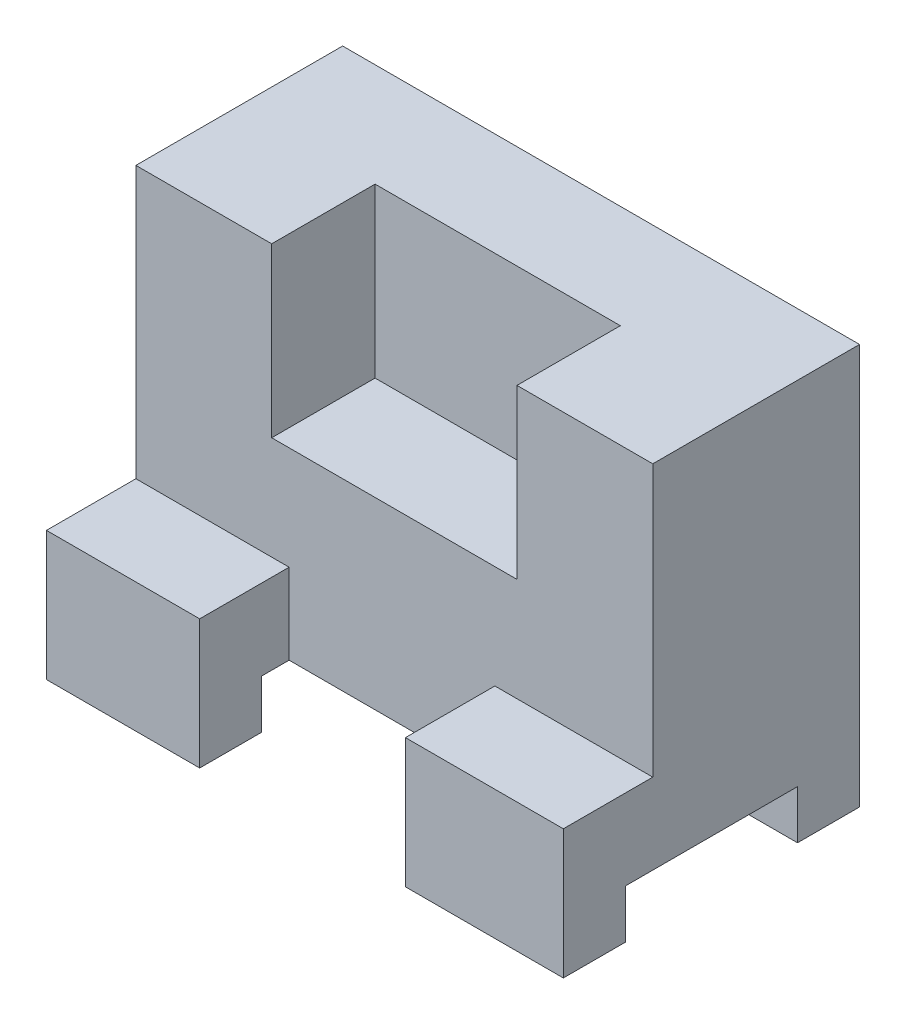
ISO-10303-21;
HEADER;
FILE_DESCRIPTION(('STEP AP214'),'2;1');
FILE_NAME('part.step','',(''),(''),'','','');
FILE_SCHEMA(('AUTOMOTIVE_DESIGN { 1 0 10303 214 1 1 1 1 }'));
ENDSEC;
DATA;
#1=APPLICATION_CONTEXT('core data for automotive mechanical design processes');
#2=APPLICATION_PROTOCOL_DEFINITION('international standard','automotive_design',2000,#1);
#3=PRODUCT_CONTEXT('',#1,'mechanical');
#4=PRODUCT('Part','Part','',(#3));
#5=PRODUCT_RELATED_PRODUCT_CATEGORY('part','',(#4));
#6=PRODUCT_DEFINITION_FORMATION('','',#4);
#7=PRODUCT_DEFINITION_CONTEXT('part definition',#1,'design');
#8=PRODUCT_DEFINITION('design','',#6,#7);
#9=PRODUCT_DEFINITION_SHAPE('','',#8);
#10=(LENGTH_UNIT() NAMED_UNIT(*) SI_UNIT(.MILLI.,.METRE.));
#11=(NAMED_UNIT(*) PLANE_ANGLE_UNIT() SI_UNIT($,.RADIAN.));
#12=(NAMED_UNIT(*) SI_UNIT($,.STERADIAN.) SOLID_ANGLE_UNIT());
#13=UNCERTAINTY_MEASURE_WITH_UNIT(LENGTH_MEASURE(1.E-05),#10,'distance_accuracy_value','');
#14=(GEOMETRIC_REPRESENTATION_CONTEXT(3) GLOBAL_UNCERTAINTY_ASSIGNED_CONTEXT((#13)) GLOBAL_UNIT_ASSIGNED_CONTEXT((#10,
#11,#12)) REPRESENTATION_CONTEXT('',''));
#15=CARTESIAN_POINT('',(0.,0.,0.));
#16=DIRECTION('',(0.,0.,1.));
#17=DIRECTION('',(1.,0.,0.));
#18=AXIS2_PLACEMENT_3D('',#15,#16,#17);
#19=CARTESIAN_POINT('',(0.,-114.3,0.));
#20=DIRECTION('',(0.,-1.,0.));
#21=DIRECTION('',(0.,0.,-1.));
#22=AXIS2_PLACEMENT_3D('',#19,#20,#21);
#23=PLANE('',#22);
#24=DIRECTION('',(-1.,0.,0.));
#25=VECTOR('',#24,1.);
#26=CARTESIAN_POINT('',(0.,-114.3,115.064252785648));
#27=LINE('',#26,#25);
#28=CARTESIAN_POINT('',(127.,-114.3,115.064252785648));
#29=VERTEX_POINT('',#28);
#30=CARTESIAN_POINT('',(49.406360537615,-114.3,115.064252785648));
#31=VERTEX_POINT('',#30);
#32=EDGE_CURVE('E49',#29,#31,#27,.T.);
#33=ORIENTED_EDGE('',*,*,#32,.F.);
#34=DIRECTION('',(0.,0.,1.));
#35=VECTOR('',#34,1.);
#36=CARTESIAN_POINT('',(127.,-114.3,0.));
#37=LINE('',#36,#35);
#38=CARTESIAN_POINT('',(127.,-114.3,145.544252785648));
#39=VERTEX_POINT('',#38);
#40=EDGE_CURVE('E232',#29,#39,#37,.T.);
#41=ORIENTED_EDGE('',*,*,#40,.T.);
#42=DIRECTION('',(-0.999999999960668,0.,-8.86923483296824E-06));
#43=VECTOR('',#42,1.);
#44=CARTESIAN_POINT('',(127.,-114.3,145.544252785648));
#45=LINE('',#44,#43);
#46=CARTESIAN_POINT('',(49.406360537615,-114.3,145.543564589438));
#47=VERTEX_POINT('',#46);
#48=EDGE_CURVE('E231',#39,#47,#45,.T.);
#49=ORIENTED_EDGE('',*,*,#48,.T.);
#50=DIRECTION('',(0.,0.,-1.));
#51=VECTOR('',#50,1.);
#52=CARTESIAN_POINT('',(49.406360537615,-114.3,145.543564589438));
#53=LINE('',#52,#51);
#54=EDGE_CURVE('E234',#47,#31,#53,.T.);
#55=ORIENTED_EDGE('',*,*,#54,.T.);
#56=EDGE_LOOP('',(#33,#41,#49,#55));
#57=FACE_BOUND('',#56,.T.);
#58=ADVANCED_FACE('F41',(#57),#23,.T.);
#59=DIRECTION('',(1.,0.,0.));
#60=VECTOR('',#59,1.);
#61=CARTESIAN_POINT('',(-127.,-114.3,115.064252785648));
#62=LINE('',#61,#60);
#63=CARTESIAN_POINT('',(-127.,-114.3,115.064252785648));
#64=VERTEX_POINT('',#63);
#65=CARTESIAN_POINT('',(-51.7027874079581,-114.3,115.064252785648));
#66=VERTEX_POINT('',#65);
#67=EDGE_CURVE('E205',#64,#66,#62,.T.);
#68=ORIENTED_EDGE('',*,*,#67,.T.);
#69=DIRECTION('',(0.,0.,1.));
#70=VECTOR('',#69,1.);
#71=CARTESIAN_POINT('',(-51.7027874079581,-114.3,101.6));
#72=LINE('',#71,#70);
#73=CARTESIAN_POINT('',(-51.7027874079581,-114.3,145.542667828661));
#74=VERTEX_POINT('',#73);
#75=EDGE_CURVE('E237',#66,#74,#72,.T.);
#76=ORIENTED_EDGE('',*,*,#75,.T.);
#77=DIRECTION('',(-0.999999999960668,0.,-8.86923483280691E-06));
#78=VECTOR('',#77,1.);
#79=CARTESIAN_POINT('',(-51.7027874079581,-114.3,145.542667828661));
#80=LINE('',#79,#78);
#81=CARTESIAN_POINT('',(-127.,-114.3,145.542));
#82=VERTEX_POINT('',#81);
#83=EDGE_CURVE('E239',#74,#82,#80,.T.);
#84=ORIENTED_EDGE('',*,*,#83,.T.);
#85=DIRECTION('',(0.,0.,-1.));
#86=VECTOR('',#85,1.);
#87=CARTESIAN_POINT('',(-127.,-114.3,145.542));
#88=LINE('',#87,#86);
#89=EDGE_CURVE('E241',#82,#64,#88,.T.);
#90=ORIENTED_EDGE('',*,*,#89,.T.);
#91=EDGE_LOOP('',(#68,#76,#84,#90));
#92=FACE_BOUND('',#91,.T.);
#93=ADVANCED_FACE('F389',(#92),#23,.T.);
#94=CARTESIAN_POINT('',(0.,0.,101.6));
#95=DIRECTION('',(0.,0.,-1.));
#96=DIRECTION('',(-1.,0.,0.));
#97=AXIS2_PLACEMENT_3D('',#94,#95,#96);
#98=PLANE('',#97);
#99=DIRECTION('',(0.,1.,0.));
#100=VECTOR('',#99,1.);
#101=CARTESIAN_POINT('',(-51.7027874079581,0.,101.6));
#102=LINE('',#101,#100);
#103=CARTESIAN_POINT('',(-51.7027874079581,-90.3754778035292,101.6));
#104=VERTEX_POINT('',#103);
#105=CARTESIAN_POINT('',(-51.7027874079581,-50.8,101.6));
#106=VERTEX_POINT('',#105);
#107=EDGE_CURVE('E326',#104,#106,#102,.T.);
#108=ORIENTED_EDGE('',*,*,#107,.F.);
#109=DIRECTION('',(1.,0.,0.));
#110=VECTOR('',#109,1.);
#111=CARTESIAN_POINT('',(0.,-90.3754778035292,101.6));
#112=LINE('',#111,#110);
#113=CARTESIAN_POINT('',(49.406360537615,-90.3754778035292,101.6));
#114=VERTEX_POINT('',#113);
#115=EDGE_CURVE('E220',#104,#114,#112,.T.);
#116=ORIENTED_EDGE('',*,*,#115,.T.);
#117=DIRECTION('',(0.,-1.,0.));
#118=VECTOR('',#117,1.);
#119=CARTESIAN_POINT('',(49.406360537615,0.,101.6));
#120=LINE('',#119,#118);
#121=CARTESIAN_POINT('',(49.406360537615,-50.8,101.6));
#122=VERTEX_POINT('',#121);
#123=EDGE_CURVE('E64',#122,#114,#120,.T.);
#124=ORIENTED_EDGE('',*,*,#123,.F.);
#125=DIRECTION('',(-1.,0.,0.));
#126=VECTOR('',#125,1.);
#127=CARTESIAN_POINT('',(0.,-50.8,101.6));
#128=LINE('',#127,#126);
#129=CARTESIAN_POINT('',(127.,-50.8,101.6));
#130=VERTEX_POINT('',#129);
#131=EDGE_CURVE('E276',#130,#122,#128,.T.);
#132=ORIENTED_EDGE('',*,*,#131,.F.);
#133=DIRECTION('',(0.,1.,0.));
#134=VECTOR('',#133,1.);
#135=CARTESIAN_POINT('',(127.,-82.55,101.6));
#136=LINE('',#135,#134);
#137=CARTESIAN_POINT('',(127.,82.55,101.6));
#138=VERTEX_POINT('',#137);
#139=EDGE_CURVE('E307',#130,#138,#136,.T.);
#140=ORIENTED_EDGE('',*,*,#139,.T.);
#141=DIRECTION('',(-1.,0.,0.));
#142=VECTOR('',#141,1.);
#143=CARTESIAN_POINT('',(-127.,82.55,101.6));
#144=LINE('',#143,#142);
#145=CARTESIAN_POINT('',(60.2599117359153,82.55,101.6));
#146=VERTEX_POINT('',#145);
#147=EDGE_CURVE('E311',#138,#146,#144,.T.);
#148=ORIENTED_EDGE('',*,*,#147,.T.);
#149=DIRECTION('',(0.,1.,0.));
#150=VECTOR('',#149,1.);
#151=CARTESIAN_POINT('',(60.2599117359153,82.55,101.6));
#152=LINE('',#151,#150);
#153=CARTESIAN_POINT('',(60.2599117359153,0.,101.6));
#154=VERTEX_POINT('',#153);
#155=EDGE_CURVE('E281',#154,#146,#152,.T.);
#156=ORIENTED_EDGE('',*,*,#155,.F.);
#157=DIRECTION('',(1.,0.,0.));
#158=VECTOR('',#157,1.);
#159=CARTESIAN_POINT('',(60.2599117359153,0.,101.6));
#160=LINE('',#159,#158);
#161=CARTESIAN_POINT('',(-60.2599117359153,0.,101.6));
#162=VERTEX_POINT('',#161);
#163=EDGE_CURVE('E293',#162,#154,#160,.T.);
#164=ORIENTED_EDGE('',*,*,#163,.F.);
#165=DIRECTION('',(0.,-1.,0.));
#166=VECTOR('',#165,1.);
#167=CARTESIAN_POINT('',(-60.2599117359153,82.55,101.6));
#168=LINE('',#167,#166);
#169=CARTESIAN_POINT('',(-60.2599117359153,82.55,101.6));
#170=VERTEX_POINT('',#169);
#171=EDGE_CURVE('E291',#170,#162,#168,.T.);
#172=ORIENTED_EDGE('',*,*,#171,.F.);
#173=CARTESIAN_POINT('',(-127.,82.55,101.6));
#174=VERTEX_POINT('',#173);
#175=EDGE_CURVE('E309',#170,#174,#144,.T.);
#176=ORIENTED_EDGE('',*,*,#175,.T.);
#177=DIRECTION('',(0.,-1.,0.));
#178=VECTOR('',#177,1.);
#179=CARTESIAN_POINT('',(-127.,-82.55,101.6));
#180=LINE('',#179,#178);
#181=CARTESIAN_POINT('',(-127.,-50.8,101.6));
#182=VERTEX_POINT('',#181);
#183=EDGE_CURVE('E314',#174,#182,#180,.T.);
#184=ORIENTED_EDGE('',*,*,#183,.T.);
#185=EDGE_CURVE('E273',#106,#182,#128,.T.);
#186=ORIENTED_EDGE('',*,*,#185,.F.);
#187=EDGE_LOOP('',(#108,#116,#124,#132,#140,#148,#156,#164,#172,#176,#184,#186));
#188=FACE_BOUND('',#187,.T.);
#189=ADVANCED_FACE('F349',(#188),#98,.F.);
#190=CARTESIAN_POINT('',(127.,-82.55,101.6));
#191=DIRECTION('',(-1.,0.,0.));
#192=DIRECTION('',(0.,0.,1.));
#193=AXIS2_PLACEMENT_3D('',#190,#191,#192);
#194=PLANE('',#193);
#195=ORIENTED_EDGE('',*,*,#40,.F.);
#196=DIRECTION('',(0.,1.,0.));
#197=VECTOR('',#196,1.);
#198=CARTESIAN_POINT('',(127.,-82.55,115.064252785648));
#199=LINE('',#198,#197);
#200=CARTESIAN_POINT('',(127.,-90.3754778035292,115.064252785648));
#201=VERTEX_POINT('',#200);
#202=EDGE_CURVE('E217',#29,#201,#199,.T.);
#203=ORIENTED_EDGE('',*,*,#202,.T.);
#204=DIRECTION('',(0.,0.,-1.));
#205=VECTOR('',#204,1.);
#206=CARTESIAN_POINT('',(127.,-90.3754778035292,101.6));
#207=LINE('',#206,#205);
#208=CARTESIAN_POINT('',(127.,-90.3754778035292,30.48));
#209=VERTEX_POINT('',#208);
#210=EDGE_CURVE('E225',#201,#209,#207,.T.);
#211=ORIENTED_EDGE('',*,*,#210,.T.);
#212=DIRECTION('',(0.,-1.,0.));
#213=VECTOR('',#212,1.);
#214=CARTESIAN_POINT('',(127.,-82.55,30.48));
#215=LINE('',#214,#213);
#216=CARTESIAN_POINT('',(127.,-114.3,30.48));
#217=VERTEX_POINT('',#216);
#218=EDGE_CURVE('E181',#209,#217,#215,.T.);
#219=ORIENTED_EDGE('',*,*,#218,.T.);
#220=CARTESIAN_POINT('',(127.,-114.3,0.));
#221=VERTEX_POINT('',#220);
#222=EDGE_CURVE('E228',#221,#217,#37,.T.);
#223=ORIENTED_EDGE('',*,*,#222,.F.);
#224=DIRECTION('',(0.,1.,0.));
#225=VECTOR('',#224,1.);
#226=CARTESIAN_POINT('',(127.,-82.55,0.));
#227=LINE('',#226,#225);
#228=CARTESIAN_POINT('',(127.,82.55,0.));
#229=VERTEX_POINT('',#228);
#230=EDGE_CURVE('E299',#221,#229,#227,.T.);
#231=ORIENTED_EDGE('',*,*,#230,.T.);
#232=DIRECTION('',(0.,0.,-1.));
#233=VECTOR('',#232,1.);
#234=CARTESIAN_POINT('',(127.,82.55,101.6));
#235=LINE('',#234,#233);
#236=EDGE_CURVE('E323',#138,#229,#235,.T.);
#237=ORIENTED_EDGE('',*,*,#236,.F.);
#238=ORIENTED_EDGE('',*,*,#139,.F.);
#239=DIRECTION('',(0.,0.,1.));
#240=VECTOR('',#239,1.);
#241=CARTESIAN_POINT('',(127.,-50.8,101.6));
#242=LINE('',#241,#240);
#243=CARTESIAN_POINT('',(127.,-50.8,145.544252785648));
#244=VERTEX_POINT('',#243);
#245=EDGE_CURVE('E227',#130,#244,#242,.T.);
#246=ORIENTED_EDGE('',*,*,#245,.T.);
#247=DIRECTION('',(0.,1.,0.));
#248=VECTOR('',#247,1.);
#249=CARTESIAN_POINT('',(127.,-114.3,145.544252785648));
#250=LINE('',#249,#248);
#251=EDGE_CURVE('E270',#39,#244,#250,.T.);
#252=ORIENTED_EDGE('',*,*,#251,.F.);
#253=EDGE_LOOP('',(#195,#203,#211,#219,#223,#231,#237,#238,#246,#252));
#254=FACE_BOUND('',#253,.T.);
#255=ADVANCED_FACE('F43',(#254),#194,.F.);
#256=CARTESIAN_POINT('',(-127.,82.55,101.6));
#257=DIRECTION('',(0.,-1.,0.));
#258=DIRECTION('',(0.,0.,-1.));
#259=AXIS2_PLACEMENT_3D('',#256,#257,#258);
#260=PLANE('',#259);
#261=ORIENTED_EDGE('',*,*,#175,.F.);
#262=DIRECTION('',(0.,0.,1.));
#263=VECTOR('',#262,1.);
#264=CARTESIAN_POINT('',(-60.2599117359153,82.55,50.8));
#265=LINE('',#264,#263);
#266=CARTESIAN_POINT('',(-60.2599117359153,82.55,50.8));
#267=VERTEX_POINT('',#266);
#268=EDGE_CURVE('E297',#267,#170,#265,.T.);
#269=ORIENTED_EDGE('',*,*,#268,.F.);
#270=DIRECTION('',(-1.,0.,0.));
#271=VECTOR('',#270,1.);
#272=CARTESIAN_POINT('',(-60.2599117359153,82.55,50.8));
#273=LINE('',#272,#271);
#274=CARTESIAN_POINT('',(60.2599117359153,82.55,50.8));
#275=VERTEX_POINT('',#274);
#276=EDGE_CURVE('E287',#275,#267,#273,.T.);
#277=ORIENTED_EDGE('',*,*,#276,.F.);
#278=DIRECTION('',(0.,0.,1.));
#279=VECTOR('',#278,1.);
#280=CARTESIAN_POINT('',(60.2599117359153,82.55,50.8));
#281=LINE('',#280,#279);
#282=EDGE_CURVE('E300',#275,#146,#281,.T.);
#283=ORIENTED_EDGE('',*,*,#282,.T.);
#284=ORIENTED_EDGE('',*,*,#147,.F.);
#285=ORIENTED_EDGE('',*,*,#236,.T.);
#286=DIRECTION('',(-1.,0.,0.));
#287=VECTOR('',#286,1.);
#288=CARTESIAN_POINT('',(-127.,82.55,0.));
#289=LINE('',#288,#287);
#290=CARTESIAN_POINT('',(-127.,82.55,0.));
#291=VERTEX_POINT('',#290);
#292=EDGE_CURVE('E318',#229,#291,#289,.T.);
#293=ORIENTED_EDGE('',*,*,#292,.T.);
#294=DIRECTION('',(0.,0.,-1.));
#295=VECTOR('',#294,1.);
#296=CARTESIAN_POINT('',(-127.,82.55,101.6));
#297=LINE('',#296,#295);
#298=EDGE_CURVE('E316',#174,#291,#297,.T.);
#299=ORIENTED_EDGE('',*,*,#298,.F.);
#300=EDGE_LOOP('',(#261,#269,#277,#283,#284,#285,#293,#299));
#301=FACE_BOUND('',#300,.T.);
#302=ADVANCED_FACE('F357',(#301),#260,.F.);
#303=CARTESIAN_POINT('',(-127.,-82.55,101.6));
#304=DIRECTION('',(1.,0.,0.));
#305=DIRECTION('',(0.,0.,-1.));
#306=AXIS2_PLACEMENT_3D('',#303,#304,#305);
#307=PLANE('',#306);
#308=DIRECTION('',(0.,0.,1.));
#309=VECTOR('',#308,1.);
#310=CARTESIAN_POINT('',(-127.,-90.3754778035292,115.064252785648));
#311=LINE('',#310,#309);
#312=CARTESIAN_POINT('',(-127.,-90.3754778035292,30.48));
#313=VERTEX_POINT('',#312);
#314=CARTESIAN_POINT('',(-127.,-90.3754778035292,115.064252785648));
#315=VERTEX_POINT('',#314);
#316=EDGE_CURVE('E188',#313,#315,#311,.T.);
#317=ORIENTED_EDGE('',*,*,#316,.T.);
#318=DIRECTION('',(0.,-1.,0.));
#319=VECTOR('',#318,1.);
#320=CARTESIAN_POINT('',(-127.,-114.3,115.064252785648));
#321=LINE('',#320,#319);
#322=EDGE_CURVE('E196',#315,#64,#321,.T.);
#323=ORIENTED_EDGE('',*,*,#322,.T.);
#324=ORIENTED_EDGE('',*,*,#89,.F.);
#325=DIRECTION('',(0.,1.,0.));
#326=VECTOR('',#325,1.);
#327=CARTESIAN_POINT('',(-127.,-114.3,145.542));
#328=LINE('',#327,#326);
#329=CARTESIAN_POINT('',(-127.,-50.8,145.542));
#330=VERTEX_POINT('',#329);
#331=EDGE_CURVE('E247',#82,#330,#328,.T.);
#332=ORIENTED_EDGE('',*,*,#331,.T.);
#333=DIRECTION('',(0.,0.,-1.));
#334=VECTOR('',#333,1.);
#335=CARTESIAN_POINT('',(-127.,-50.8,101.6));
#336=LINE('',#335,#334);
#337=EDGE_CURVE('E259',#330,#182,#336,.T.);
#338=ORIENTED_EDGE('',*,*,#337,.T.);
#339=ORIENTED_EDGE('',*,*,#183,.F.);
#340=ORIENTED_EDGE('',*,*,#298,.T.);
#341=DIRECTION('',(0.,-1.,0.));
#342=VECTOR('',#341,1.);
#343=CARTESIAN_POINT('',(-127.,-82.55,0.));
#344=LINE('',#343,#342);
#345=CARTESIAN_POINT('',(-127.,-114.3,0.));
#346=VERTEX_POINT('',#345);
#347=EDGE_CURVE('E310',#291,#346,#344,.T.);
#348=ORIENTED_EDGE('',*,*,#347,.T.);
#349=CARTESIAN_POINT('',(-127.,-114.3,30.48));
#350=VERTEX_POINT('',#349);
#351=EDGE_CURVE('E201',#350,#346,#88,.T.);
#352=ORIENTED_EDGE('',*,*,#351,.F.);
#353=DIRECTION('',(0.,1.,0.));
#354=VECTOR('',#353,1.);
#355=CARTESIAN_POINT('',(-127.,-90.3754778035292,30.48));
#356=LINE('',#355,#354);
#357=EDGE_CURVE('E56',#350,#313,#356,.T.);
#358=ORIENTED_EDGE('',*,*,#357,.T.);
#359=EDGE_LOOP('',(#317,#323,#324,#332,#338,#339,#340,#348,#352,#358));
#360=FACE_BOUND('',#359,.T.);
#361=ADVANCED_FACE('F199',(#360),#307,.F.);
#362=CARTESIAN_POINT('',(0.,0.,0.));
#363=DIRECTION('',(0.,0.,-1.));
#364=DIRECTION('',(-1.,0.,0.));
#365=AXIS2_PLACEMENT_3D('',#362,#363,#364);
#366=PLANE('',#365);
#367=DIRECTION('',(1.,0.,0.));
#368=VECTOR('',#367,1.);
#369=CARTESIAN_POINT('',(-127.,-114.3,0.));
#370=LINE('',#369,#368);
#371=EDGE_CURVE('E244',#346,#221,#370,.T.);
#372=ORIENTED_EDGE('',*,*,#371,.F.);
#373=ORIENTED_EDGE('',*,*,#347,.F.);
#374=ORIENTED_EDGE('',*,*,#292,.F.);
#375=ORIENTED_EDGE('',*,*,#230,.F.);
#376=EDGE_LOOP('',(#372,#373,#374,#375));
#377=FACE_BOUND('',#376,.T.);
#378=ADVANCED_FACE('F416',(#377),#366,.T.);
#379=CARTESIAN_POINT('',(-60.2599117359153,82.55,50.8));
#380=DIRECTION('',(-1.,0.,0.));
#381=DIRECTION('',(0.,-1.,0.));
#382=AXIS2_PLACEMENT_3D('',#379,#380,#381);
#383=PLANE('',#382);
#384=ORIENTED_EDGE('',*,*,#171,.T.);
#385=DIRECTION('',(0.,0.,1.));
#386=VECTOR('',#385,1.);
#387=CARTESIAN_POINT('',(-60.2599117359153,0.,50.8));
#388=LINE('',#387,#386);
#389=CARTESIAN_POINT('',(-60.2599117359153,0.,50.8));
#390=VERTEX_POINT('',#389);
#391=EDGE_CURVE('E290',#390,#162,#388,.T.);
#392=ORIENTED_EDGE('',*,*,#391,.F.);
#393=DIRECTION('',(0.,-1.,0.));
#394=VECTOR('',#393,1.);
#395=CARTESIAN_POINT('',(-60.2599117359153,82.55,50.8));
#396=LINE('',#395,#394);
#397=EDGE_CURVE('E277',#267,#390,#396,.T.);
#398=ORIENTED_EDGE('',*,*,#397,.F.);
#399=ORIENTED_EDGE('',*,*,#268,.T.);
#400=EDGE_LOOP('',(#384,#392,#398,#399));
#401=FACE_BOUND('',#400,.T.);
#402=ADVANCED_FACE('F370',(#401),#383,.F.);
#403=CARTESIAN_POINT('',(60.2599117359153,82.55,50.8));
#404=DIRECTION('',(1.,0.,0.));
#405=DIRECTION('',(0.,1.,0.));
#406=AXIS2_PLACEMENT_3D('',#403,#404,#405);
#407=PLANE('',#406);
#408=ORIENTED_EDGE('',*,*,#155,.T.);
#409=ORIENTED_EDGE('',*,*,#282,.F.);
#410=DIRECTION('',(0.,1.,0.));
#411=VECTOR('',#410,1.);
#412=CARTESIAN_POINT('',(60.2599117359153,82.55,50.8));
#413=LINE('',#412,#411);
#414=CARTESIAN_POINT('',(60.2599117359153,0.,50.8));
#415=VERTEX_POINT('',#414);
#416=EDGE_CURVE('E284',#415,#275,#413,.T.);
#417=ORIENTED_EDGE('',*,*,#416,.F.);
#418=DIRECTION('',(0.,0.,1.));
#419=VECTOR('',#418,1.);
#420=CARTESIAN_POINT('',(60.2599117359153,0.,50.8));
#421=LINE('',#420,#419);
#422=EDGE_CURVE('E303',#415,#154,#421,.T.);
#423=ORIENTED_EDGE('',*,*,#422,.T.);
#424=EDGE_LOOP('',(#408,#409,#417,#423));
#425=FACE_BOUND('',#424,.T.);
#426=ADVANCED_FACE('F364',(#425),#407,.F.);
#427=CARTESIAN_POINT('',(60.2599117359153,0.,50.8));
#428=DIRECTION('',(0.,-1.,0.));
#429=DIRECTION('',(1.,0.,0.));
#430=AXIS2_PLACEMENT_3D('',#427,#428,#429);
#431=PLANE('',#430);
#432=ORIENTED_EDGE('',*,*,#163,.T.);
#433=ORIENTED_EDGE('',*,*,#422,.F.);
#434=DIRECTION('',(1.,0.,0.));
#435=VECTOR('',#434,1.);
#436=CARTESIAN_POINT('',(60.2599117359153,0.,50.8));
#437=LINE('',#436,#435);
#438=EDGE_CURVE('E280',#390,#415,#437,.T.);
#439=ORIENTED_EDGE('',*,*,#438,.F.);
#440=ORIENTED_EDGE('',*,*,#391,.T.);
#441=EDGE_LOOP('',(#432,#433,#439,#440));
#442=FACE_BOUND('',#441,.T.);
#443=ADVANCED_FACE('F368',(#442),#431,.F.);
#444=CARTESIAN_POINT('',(0.,0.,50.8));
#445=DIRECTION('',(0.,0.,-1.));
#446=DIRECTION('',(-1.,0.,0.));
#447=AXIS2_PLACEMENT_3D('',#444,#445,#446);
#448=PLANE('',#447);
#449=ORIENTED_EDGE('',*,*,#397,.T.);
#450=ORIENTED_EDGE('',*,*,#438,.T.);
#451=ORIENTED_EDGE('',*,*,#416,.T.);
#452=ORIENTED_EDGE('',*,*,#276,.T.);
#453=EDGE_LOOP('',(#449,#450,#451,#452));
#454=FACE_BOUND('',#453,.T.);
#455=ADVANCED_FACE('F451',(#454),#448,.F.);
#456=CARTESIAN_POINT('',(0.,-50.8,0.));
#457=DIRECTION('',(0.,-1.,0.));
#458=DIRECTION('',(0.,0.,-1.));
#459=AXIS2_PLACEMENT_3D('',#456,#457,#458);
#460=PLANE('',#459);
#461=ORIENTED_EDGE('',*,*,#245,.F.);
#462=ORIENTED_EDGE('',*,*,#131,.T.);
#463=DIRECTION('',(0.,0.,-1.));
#464=VECTOR('',#463,1.);
#465=CARTESIAN_POINT('',(49.406360537615,-50.8,145.543564589438));
#466=LINE('',#465,#464);
#467=CARTESIAN_POINT('',(49.406360537615,-50.8,145.543564589438));
#468=VERTEX_POINT('',#467);
#469=EDGE_CURVE('E251',#468,#122,#466,.T.);
#470=ORIENTED_EDGE('',*,*,#469,.F.);
#471=DIRECTION('',(-0.999999999960668,0.,-8.86923483296824E-06));
#472=VECTOR('',#471,1.);
#473=CARTESIAN_POINT('',(127.,-50.8,145.544252785648));
#474=LINE('',#473,#472);
#475=EDGE_CURVE('E249',#244,#468,#474,.T.);
#476=ORIENTED_EDGE('',*,*,#475,.F.);
#477=EDGE_LOOP('',(#461,#462,#470,#476));
#478=FACE_BOUND('',#477,.T.);
#479=ADVANCED_FACE('F346',(#478),#460,.F.);
#480=DIRECTION('',(0.,0.,1.));
#481=VECTOR('',#480,1.);
#482=CARTESIAN_POINT('',(-51.7027874079581,-50.8,101.6));
#483=LINE('',#482,#481);
#484=CARTESIAN_POINT('',(-51.7027874079581,-50.8,145.542667828661));
#485=VERTEX_POINT('',#484);
#486=EDGE_CURVE('E254',#106,#485,#483,.T.);
#487=ORIENTED_EDGE('',*,*,#486,.F.);
#488=ORIENTED_EDGE('',*,*,#185,.T.);
#489=ORIENTED_EDGE('',*,*,#337,.F.);
#490=DIRECTION('',(-0.999999999960668,0.,-8.86923483280691E-06));
#491=VECTOR('',#490,1.);
#492=CARTESIAN_POINT('',(-51.7027874079581,-50.8,145.542667828661));
#493=LINE('',#492,#491);
#494=EDGE_CURVE('E256',#485,#330,#493,.T.);
#495=ORIENTED_EDGE('',*,*,#494,.F.);
#496=EDGE_LOOP('',(#487,#488,#489,#495));
#497=FACE_BOUND('',#496,.T.);
#498=ADVANCED_FACE('F377',(#497),#460,.F.);
#499=CARTESIAN_POINT('',(127.,-114.3,145.544252785648));
#500=DIRECTION('',(8.86923483296824E-06,0.,-0.999999999960668));
#501=DIRECTION('',(-0.999999999960668,0.,-8.86923483296824E-06));
#502=AXIS2_PLACEMENT_3D('',#499,#500,#501);
#503=PLANE('',#502);
#504=ORIENTED_EDGE('',*,*,#475,.T.);
#505=DIRECTION('',(0.,1.,0.));
#506=VECTOR('',#505,1.);
#507=CARTESIAN_POINT('',(49.406360537615,-114.3,145.543564589438));
#508=LINE('',#507,#506);
#509=EDGE_CURVE('E267',#47,#468,#508,.T.);
#510=ORIENTED_EDGE('',*,*,#509,.F.);
#511=ORIENTED_EDGE('',*,*,#48,.F.);
#512=ORIENTED_EDGE('',*,*,#251,.T.);
#513=EDGE_LOOP('',(#504,#510,#511,#512));
#514=FACE_BOUND('',#513,.T.);
#515=ADVANCED_FACE('F341',(#514),#503,.F.);
#516=CARTESIAN_POINT('',(49.406360537615,-114.3,145.543564589438));
#517=DIRECTION('',(1.,0.,0.));
#518=DIRECTION('',(0.,0.,-1.));
#519=AXIS2_PLACEMENT_3D('',#516,#517,#518);
#520=PLANE('',#519);
#521=DIRECTION('',(0.,0.,1.));
#522=VECTOR('',#521,1.);
#523=CARTESIAN_POINT('',(49.406360537615,-90.3754778035292,145.543564589438));
#524=LINE('',#523,#522);
#525=CARTESIAN_POINT('',(49.406360537615,-90.3754778035292,115.064252785648));
#526=VERTEX_POINT('',#525);
#527=EDGE_CURVE('E222',#114,#526,#524,.T.);
#528=ORIENTED_EDGE('',*,*,#527,.T.);
#529=DIRECTION('',(0.,-1.,0.));
#530=VECTOR('',#529,1.);
#531=CARTESIAN_POINT('',(49.406360537615,-114.3,115.064252785648));
#532=LINE('',#531,#530);
#533=EDGE_CURVE('E214',#526,#31,#532,.T.);
#534=ORIENTED_EDGE('',*,*,#533,.T.);
#535=ORIENTED_EDGE('',*,*,#54,.F.);
#536=ORIENTED_EDGE('',*,*,#509,.T.);
#537=ORIENTED_EDGE('',*,*,#469,.T.);
#538=ORIENTED_EDGE('',*,*,#123,.T.);
#539=EDGE_LOOP('',(#528,#534,#535,#536,#537,#538));
#540=FACE_BOUND('',#539,.T.);
#541=ADVANCED_FACE('F336',(#540),#520,.F.);
#542=CARTESIAN_POINT('',(-51.7027874079581,-114.3,101.6));
#543=DIRECTION('',(-1.,0.,0.));
#544=DIRECTION('',(0.,0.,1.));
#545=AXIS2_PLACEMENT_3D('',#542,#543,#544);
#546=PLANE('',#545);
#547=ORIENTED_EDGE('',*,*,#75,.F.);
#548=DIRECTION('',(0.,1.,0.));
#549=VECTOR('',#548,1.);
#550=CARTESIAN_POINT('',(-51.7027874079581,-114.3,115.064252785648));
#551=LINE('',#550,#549);
#552=CARTESIAN_POINT('',(-51.7027874079581,-90.3754778035292,115.064252785648));
#553=VERTEX_POINT('',#552);
#554=EDGE_CURVE('E211',#66,#553,#551,.T.);
#555=ORIENTED_EDGE('',*,*,#554,.T.);
#556=DIRECTION('',(0.,0.,-1.));
#557=VECTOR('',#556,1.);
#558=CARTESIAN_POINT('',(-51.7027874079581,-90.3754778035292,101.6));
#559=LINE('',#558,#557);
#560=EDGE_CURVE('E11',#553,#104,#559,.T.);
#561=ORIENTED_EDGE('',*,*,#560,.T.);
#562=ORIENTED_EDGE('',*,*,#107,.T.);
#563=ORIENTED_EDGE('',*,*,#486,.T.);
#564=DIRECTION('',(0.,1.,0.));
#565=VECTOR('',#564,1.);
#566=CARTESIAN_POINT('',(-51.7027874079581,-114.3,145.542667828661));
#567=LINE('',#566,#565);
#568=EDGE_CURVE('E264',#74,#485,#567,.T.);
#569=ORIENTED_EDGE('',*,*,#568,.F.);
#570=EDGE_LOOP('',(#547,#555,#561,#562,#563,#569));
#571=FACE_BOUND('',#570,.T.);
#572=ADVANCED_FACE('F382',(#571),#546,.F.);
#573=CARTESIAN_POINT('',(-51.7027874079581,-114.3,145.542667828661));
#574=DIRECTION('',(8.86923483280691E-06,0.,-0.999999999960668));
#575=DIRECTION('',(-0.999999999960668,0.,-8.86923483280691E-06));
#576=AXIS2_PLACEMENT_3D('',#573,#574,#575);
#577=PLANE('',#576);
#578=ORIENTED_EDGE('',*,*,#494,.T.);
#579=ORIENTED_EDGE('',*,*,#331,.F.);
#580=ORIENTED_EDGE('',*,*,#83,.F.);
#581=ORIENTED_EDGE('',*,*,#568,.T.);
#582=EDGE_LOOP('',(#578,#579,#580,#581));
#583=FACE_BOUND('',#582,.T.);
#584=ADVANCED_FACE('F385',(#583),#577,.F.);
#585=DIRECTION('',(1.,0.,0.));
#586=VECTOR('',#585,1.);
#587=CARTESIAN_POINT('',(-127.,-114.3,30.48));
#588=LINE('',#587,#586);
#589=EDGE_CURVE('E185',#350,#217,#588,.T.);
#590=ORIENTED_EDGE('',*,*,#589,.F.);
#591=ORIENTED_EDGE('',*,*,#351,.T.);
#592=ORIENTED_EDGE('',*,*,#371,.T.);
#593=ORIENTED_EDGE('',*,*,#222,.T.);
#594=EDGE_LOOP('',(#590,#591,#592,#593));
#595=FACE_BOUND('',#594,.T.);
#596=ADVANCED_FACE('F402',(#595),#23,.T.);
#597=CARTESIAN_POINT('',(-127.,-90.3754778035292,115.064252785648));
#598=DIRECTION('',(0.,1.,0.));
#599=DIRECTION('',(0.,0.,1.));
#600=AXIS2_PLACEMENT_3D('',#597,#598,#599);
#601=PLANE('',#600);
#602=DIRECTION('',(1.,0.,0.));
#603=VECTOR('',#602,1.);
#604=CARTESIAN_POINT('',(-127.,-90.3754778035292,115.064252785648));
#605=LINE('',#604,#603);
#606=EDGE_CURVE('E184',#526,#201,#605,.T.);
#607=ORIENTED_EDGE('',*,*,#606,.F.);
#608=ORIENTED_EDGE('',*,*,#527,.F.);
#609=ORIENTED_EDGE('',*,*,#115,.F.);
#610=ORIENTED_EDGE('',*,*,#560,.F.);
#611=EDGE_CURVE('E192',#315,#553,#605,.T.);
#612=ORIENTED_EDGE('',*,*,#611,.F.);
#613=ORIENTED_EDGE('',*,*,#316,.F.);
#614=DIRECTION('',(1.,0.,0.));
#615=VECTOR('',#614,1.);
#616=CARTESIAN_POINT('',(-127.,-90.3754778035292,30.48));
#617=LINE('',#616,#615);
#618=EDGE_CURVE('E177',#313,#209,#617,.T.);
#619=ORIENTED_EDGE('',*,*,#618,.T.);
#620=ORIENTED_EDGE('',*,*,#210,.F.);
#621=EDGE_LOOP('',(#607,#608,#609,#610,#612,#613,#619,#620));
#622=FACE_BOUND('',#621,.T.);
#623=ADVANCED_FACE('F190',(#622),#601,.F.);
#624=CARTESIAN_POINT('',(-127.,-114.3,115.064252785648));
#625=DIRECTION('',(0.,0.,1.));
#626=DIRECTION('',(1.,0.,0.));
#627=AXIS2_PLACEMENT_3D('',#624,#625,#626);
#628=PLANE('',#627);
#629=ORIENTED_EDGE('',*,*,#32,.T.);
#630=ORIENTED_EDGE('',*,*,#533,.F.);
#631=ORIENTED_EDGE('',*,*,#606,.T.);
#632=ORIENTED_EDGE('',*,*,#202,.F.);
#633=EDGE_LOOP('',(#629,#630,#631,#632));
#634=FACE_BOUND('',#633,.T.);
#635=ADVANCED_FACE('F330',(#634),#628,.F.);
#636=ORIENTED_EDGE('',*,*,#67,.F.);
#637=ORIENTED_EDGE('',*,*,#322,.F.);
#638=ORIENTED_EDGE('',*,*,#611,.T.);
#639=ORIENTED_EDGE('',*,*,#554,.F.);
#640=EDGE_LOOP('',(#636,#637,#638,#639));
#641=FACE_BOUND('',#640,.T.);
#642=ADVANCED_FACE('F391',(#641),#628,.F.);
#643=CARTESIAN_POINT('',(-127.,-90.3754778035292,30.48));
#644=DIRECTION('',(0.,0.,-1.));
#645=DIRECTION('',(0.,1.,0.));
#646=AXIS2_PLACEMENT_3D('',#643,#644,#645);
#647=PLANE('',#646);
#648=ORIENTED_EDGE('',*,*,#618,.F.);
#649=ORIENTED_EDGE('',*,*,#357,.F.);
#650=ORIENTED_EDGE('',*,*,#589,.T.);
#651=ORIENTED_EDGE('',*,*,#218,.F.);
#652=EDGE_LOOP('',(#648,#649,#650,#651));
#653=FACE_BOUND('',#652,.T.);
#654=ADVANCED_FACE('F179',(#653),#647,.F.);
#655=CLOSED_SHELL('',(#58,#93,#189,#255,#302,#361,#378,#402,#426,#443,#455,#479,#498,#515,#541,
#572,#584,#596,#623,#635,#642,#654));
#656=MANIFOLD_SOLID_BREP('B2',#655);
#657=ADVANCED_BREP_SHAPE_REPRESENTATION('',(#18,#656),#14);
#658=SHAPE_DEFINITION_REPRESENTATION(#9,#657);
ENDSEC;
END-ISO-10303-21;
